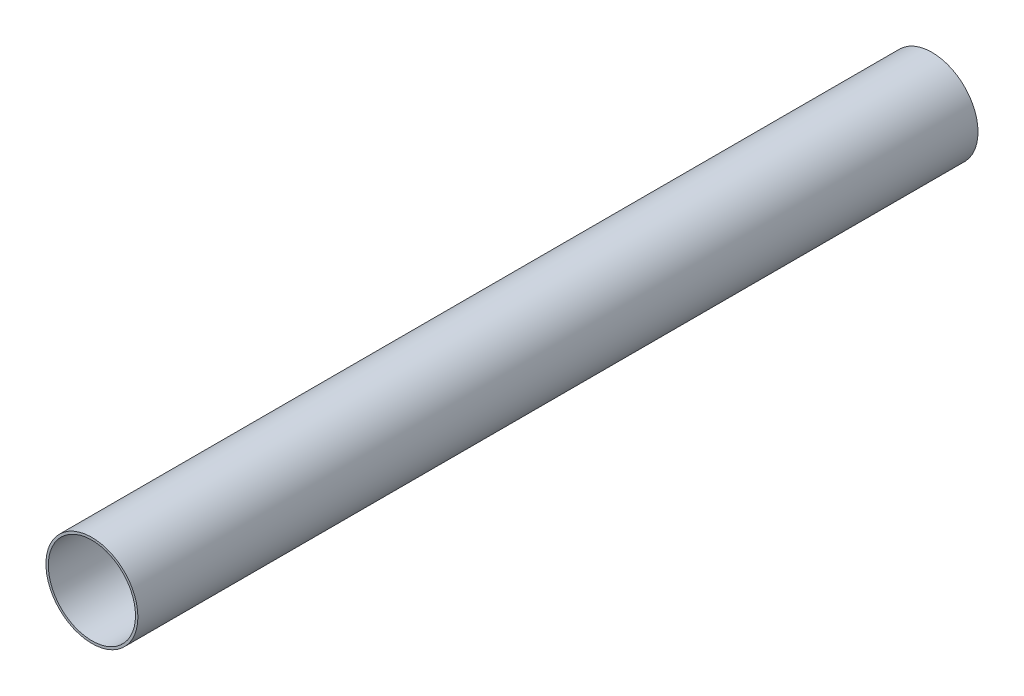
ISO-10303-21;
HEADER;
FILE_DESCRIPTION(('STEP AP214'),'2;1');
FILE_NAME('part.step','',(''),(''),'','','');
FILE_SCHEMA(('AUTOMOTIVE_DESIGN { 1 0 10303 214 1 1 1 1 }'));
ENDSEC;
DATA;
#1=APPLICATION_CONTEXT('core data for automotive mechanical design processes');
#2=APPLICATION_PROTOCOL_DEFINITION('international standard','automotive_design',2000,#1);
#3=PRODUCT_CONTEXT('',#1,'mechanical');
#4=PRODUCT('Part','Part','',(#3));
#5=PRODUCT_RELATED_PRODUCT_CATEGORY('part','',(#4));
#6=PRODUCT_DEFINITION_FORMATION('','',#4);
#7=PRODUCT_DEFINITION_CONTEXT('part definition',#1,'design');
#8=PRODUCT_DEFINITION('design','',#6,#7);
#9=PRODUCT_DEFINITION_SHAPE('','',#8);
#10=(LENGTH_UNIT() NAMED_UNIT(*) SI_UNIT(.MILLI.,.METRE.));
#11=(NAMED_UNIT(*) PLANE_ANGLE_UNIT() SI_UNIT($,.RADIAN.));
#12=(NAMED_UNIT(*) SI_UNIT($,.STERADIAN.) SOLID_ANGLE_UNIT());
#13=UNCERTAINTY_MEASURE_WITH_UNIT(LENGTH_MEASURE(1.E-05),#10,'distance_accuracy_value','');
#14=(GEOMETRIC_REPRESENTATION_CONTEXT(3) GLOBAL_UNCERTAINTY_ASSIGNED_CONTEXT((#13)) GLOBAL_UNIT_ASSIGNED_CONTEXT((#10,
#11,#12)) REPRESENTATION_CONTEXT('',''));
#15=CARTESIAN_POINT('',(0.,0.,0.));
#16=DIRECTION('',(0.,0.,1.));
#17=DIRECTION('',(1.,0.,0.));
#18=AXIS2_PLACEMENT_3D('',#15,#16,#17);
#19=CARTESIAN_POINT('',(0.,0.,279.4));
#20=DIRECTION('',(0.,0.,1.));
#21=DIRECTION('',(1.,0.,0.));
#22=AXIS2_PLACEMENT_3D('',#19,#20,#21);
#23=PLANE('',#22);
#24=CARTESIAN_POINT('',(0.,0.,279.4));
#25=DIRECTION('',(0.,0.,1.));
#26=DIRECTION('',(1.,0.,0.));
#27=AXIS2_PLACEMENT_3D('',#24,#25,#26);
#28=CIRCLE('',#27,15.29375);
#29=CARTESIAN_POINT('',(15.29375,0.,279.4));
#30=VERTEX_POINT('',#29);
#31=EDGE_CURVE('E10',#30,#30,#28,.T.);
#32=ORIENTED_EDGE('',*,*,#31,.T.);
#33=EDGE_LOOP('',(#32));
#34=FACE_BOUND('',#33,.T.);
#35=CARTESIAN_POINT('',(0.,0.,279.4));
#36=DIRECTION('',(0.,0.,1.));
#37=DIRECTION('',(1.,0.,0.));
#38=AXIS2_PLACEMENT_3D('',#35,#36,#37);
#39=CIRCLE('',#38,14.5);
#40=CARTESIAN_POINT('',(14.5,0.,279.4));
#41=VERTEX_POINT('',#40);
#42=EDGE_CURVE('E56',#41,#41,#39,.T.);
#43=ORIENTED_EDGE('',*,*,#42,.F.);
#44=EDGE_LOOP('',(#43));
#45=FACE_BOUND('',#44,.T.);
#46=ADVANCED_FACE('F43',(#34,#45),#23,.T.);
#47=CARTESIAN_POINT('',(0.,0.,0.));
#48=DIRECTION('',(0.,0.,1.));
#49=DIRECTION('',(1.,0.,0.));
#50=AXIS2_PLACEMENT_3D('',#47,#48,#49);
#51=PLANE('',#50);
#52=CARTESIAN_POINT('',(0.,0.,0.));
#53=DIRECTION('',(0.,0.,1.));
#54=DIRECTION('',(1.,0.,0.));
#55=AXIS2_PLACEMENT_3D('',#52,#53,#54);
#56=CIRCLE('',#55,15.29375);
#57=CARTESIAN_POINT('',(15.29375,0.,0.));
#58=VERTEX_POINT('',#57);
#59=EDGE_CURVE('E47',#58,#58,#56,.T.);
#60=ORIENTED_EDGE('',*,*,#59,.F.);
#61=EDGE_LOOP('',(#60));
#62=FACE_BOUND('',#61,.T.);
#63=CARTESIAN_POINT('',(0.,0.,0.));
#64=DIRECTION('',(0.,0.,1.));
#65=DIRECTION('',(1.,0.,0.));
#66=AXIS2_PLACEMENT_3D('',#63,#64,#65);
#67=CIRCLE('',#66,14.5);
#68=CARTESIAN_POINT('',(14.5,0.,0.));
#69=VERTEX_POINT('',#68);
#70=EDGE_CURVE('E58',#69,#69,#67,.T.);
#71=ORIENTED_EDGE('',*,*,#70,.T.);
#72=EDGE_LOOP('',(#71));
#73=FACE_BOUND('',#72,.T.);
#74=ADVANCED_FACE('F70',(#62,#73),#51,.F.);
#75=CARTESIAN_POINT('',(0.,0.,279.4));
#76=DIRECTION('',(0.,0.,-1.));
#77=DIRECTION('',(-1.,0.,0.));
#78=AXIS2_PLACEMENT_3D('',#75,#76,#77);
#79=CYLINDRICAL_SURFACE('',#78,15.29375);
#80=ORIENTED_EDGE('',*,*,#31,.F.);
#81=EDGE_LOOP('',(#80));
#82=FACE_BOUND('',#81,.T.);
#83=ORIENTED_EDGE('',*,*,#59,.T.);
#84=EDGE_LOOP('',(#83));
#85=FACE_BOUND('',#84,.T.);
#86=ADVANCED_FACE('F45',(#82,#85),#79,.T.);
#87=CARTESIAN_POINT('',(0.,0.,279.4));
#88=DIRECTION('',(0.,0.,-1.));
#89=DIRECTION('',(-1.,0.,0.));
#90=AXIS2_PLACEMENT_3D('',#87,#88,#89);
#91=CYLINDRICAL_SURFACE('',#90,14.5);
#92=ORIENTED_EDGE('',*,*,#42,.T.);
#93=EDGE_LOOP('',(#92));
#94=FACE_BOUND('',#93,.T.);
#95=ORIENTED_EDGE('',*,*,#70,.F.);
#96=EDGE_LOOP('',(#95));
#97=FACE_BOUND('',#96,.T.);
#98=ADVANCED_FACE('F66',(#94,#97),#91,.F.);
#99=CLOSED_SHELL('',(#46,#74,#86,#98));
#100=MANIFOLD_SOLID_BREP('B2',#99);
#101=ADVANCED_BREP_SHAPE_REPRESENTATION('',(#18,#100),#14);
#102=SHAPE_DEFINITION_REPRESENTATION(#9,#101);
ENDSEC;
END-ISO-10303-21;
